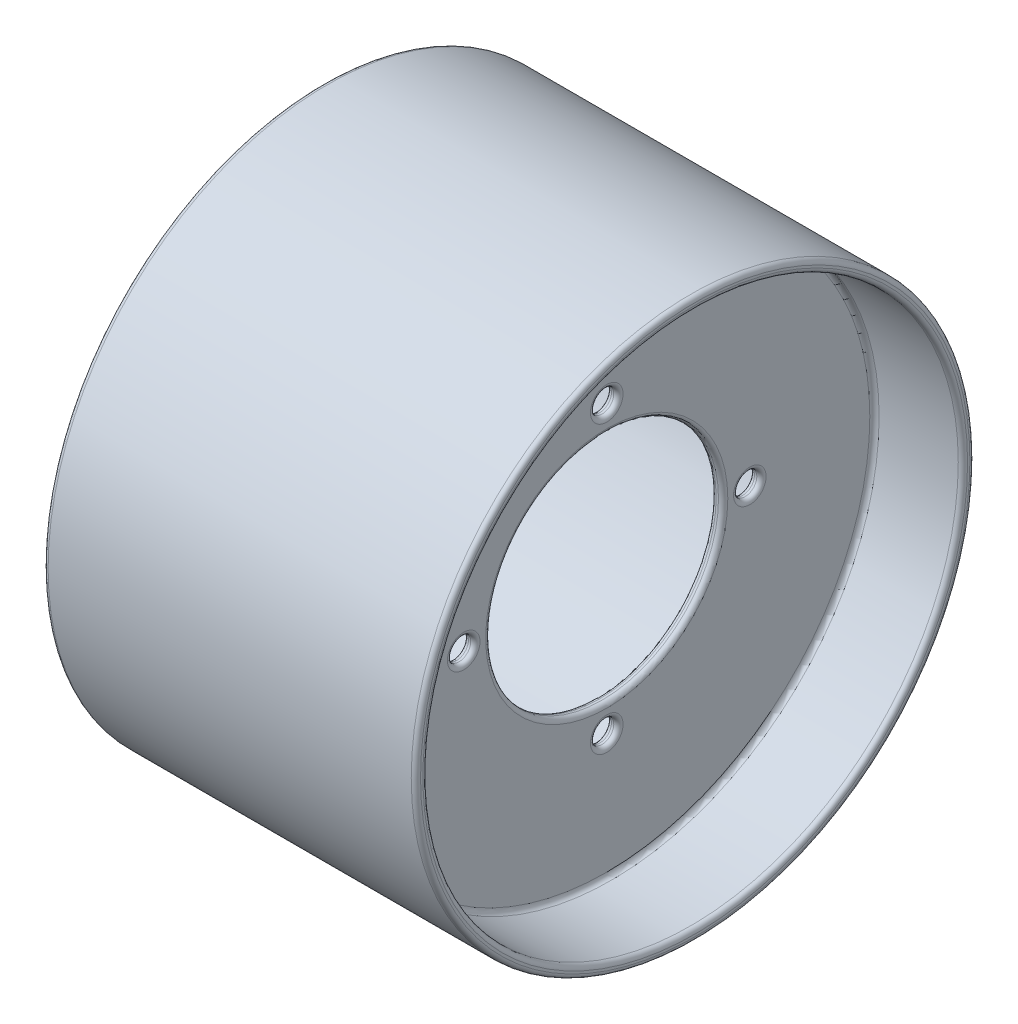
ISO-10303-21;
HEADER;
FILE_DESCRIPTION(('STEP AP214'),'2;1');
FILE_NAME('part.step','',(''),(''),'','','');
FILE_SCHEMA(('AUTOMOTIVE_DESIGN { 1 0 10303 214 1 1 1 1 }'));
ENDSEC;
DATA;
#1=APPLICATION_CONTEXT('core data for automotive mechanical design processes');
#2=APPLICATION_PROTOCOL_DEFINITION('international standard','automotive_design',2000,#1);
#3=PRODUCT_CONTEXT('',#1,'mechanical');
#4=PRODUCT('Part','Part','',(#3));
#5=PRODUCT_RELATED_PRODUCT_CATEGORY('part','',(#4));
#6=PRODUCT_DEFINITION_FORMATION('','',#4);
#7=PRODUCT_DEFINITION_CONTEXT('part definition',#1,'design');
#8=PRODUCT_DEFINITION('design','',#6,#7);
#9=PRODUCT_DEFINITION_SHAPE('','',#8);
#10=(LENGTH_UNIT() NAMED_UNIT(*) SI_UNIT(.MILLI.,.METRE.));
#11=(NAMED_UNIT(*) PLANE_ANGLE_UNIT() SI_UNIT($,.RADIAN.));
#12=(NAMED_UNIT(*) SI_UNIT($,.STERADIAN.) SOLID_ANGLE_UNIT());
#13=UNCERTAINTY_MEASURE_WITH_UNIT(LENGTH_MEASURE(1.E-05),#10,'distance_accuracy_value','');
#14=(GEOMETRIC_REPRESENTATION_CONTEXT(3) GLOBAL_UNCERTAINTY_ASSIGNED_CONTEXT((#13)) GLOBAL_UNIT_ASSIGNED_CONTEXT((#10,
#11,#12)) REPRESENTATION_CONTEXT('',''));
#15=CARTESIAN_POINT('',(0.,0.,0.));
#16=DIRECTION('',(0.,0.,1.));
#17=DIRECTION('',(1.,0.,0.));
#18=AXIS2_PLACEMENT_3D('',#15,#16,#17);
#19=CARTESIAN_POINT('',(203.2,0.,0.));
#20=DIRECTION('',(-1.,0.,0.));
#21=DIRECTION('',(0.,0.,1.));
#22=AXIS2_PLACEMENT_3D('',#19,#20,#21);
#23=CYLINDRICAL_SURFACE('',#22,146.05);
#24=CARTESIAN_POINT('',(146.05,0.,0.));
#25=DIRECTION('',(1.,0.,0.));
#26=DIRECTION('',(0.,0.,-1.));
#27=AXIS2_PLACEMENT_3D('',#24,#25,#26);
#28=CIRCLE('',#27,146.05);
#29=CARTESIAN_POINT('',(146.05,0.,-146.05));
#30=VERTEX_POINT('',#29);
#31=EDGE_CURVE('E108',#30,#30,#28,.T.);
#32=ORIENTED_EDGE('',*,*,#31,.T.);
#33=EDGE_LOOP('',(#32));
#34=FACE_BOUND('',#33,.T.);
#35=CARTESIAN_POINT('',(2.53999999999999,0.,0.));
#36=DIRECTION('',(1.,0.,0.));
#37=DIRECTION('',(0.,0.,-1.));
#38=AXIS2_PLACEMENT_3D('',#35,#36,#37);
#39=CIRCLE('',#38,146.05);
#40=CARTESIAN_POINT('',(2.53999999999999,0.,-146.05));
#41=VERTEX_POINT('',#40);
#42=EDGE_CURVE('E111',#41,#41,#39,.F.);
#43=ORIENTED_EDGE('',*,*,#42,.T.);
#44=EDGE_LOOP('',(#43));
#45=FACE_BOUND('',#44,.T.);
#46=ADVANCED_FACE('F31',(#34,#45),#23,.F.);
#47=CARTESIAN_POINT('',(203.2,0.,0.));
#48=DIRECTION('',(1.,0.,0.));
#49=DIRECTION('',(0.,0.,-1.));
#50=AXIS2_PLACEMENT_3D('',#47,#48,#49);
#51=PLANE('',#50);
#52=CARTESIAN_POINT('',(203.2,0.,0.));
#53=DIRECTION('',(1.,0.,0.));
#54=DIRECTION('',(0.,0.,-1.));
#55=AXIS2_PLACEMENT_3D('',#52,#53,#54);
#56=CIRCLE('',#55,149.86);
#57=CARTESIAN_POINT('',(203.2,0.,-149.86));
#58=VERTEX_POINT('',#57);
#59=EDGE_CURVE('E129',#58,#58,#56,.T.);
#60=ORIENTED_EDGE('',*,*,#59,.T.);
#61=EDGE_LOOP('',(#60));
#62=FACE_BOUND('',#61,.T.);
#63=CARTESIAN_POINT('',(203.2,0.,0.));
#64=DIRECTION('',(1.,0.,0.));
#65=DIRECTION('',(0.,0.,-1.));
#66=AXIS2_PLACEMENT_3D('',#63,#64,#65);
#67=CIRCLE('',#66,148.59);
#68=CARTESIAN_POINT('',(203.2,0.,-148.59));
#69=VERTEX_POINT('',#68);
#70=EDGE_CURVE('E132',#69,#69,#67,.F.);
#71=ORIENTED_EDGE('',*,*,#70,.T.);
#72=EDGE_LOOP('',(#71));
#73=FACE_BOUND('',#72,.T.);
#74=ADVANCED_FACE('F136',(#62,#73),#51,.T.);
#75=CARTESIAN_POINT('',(0.,0.,0.));
#76=DIRECTION('',(1.,0.,0.));
#77=DIRECTION('',(0.,0.,-1.));
#78=AXIS2_PLACEMENT_3D('',#75,#76,#77);
#79=PLANE('',#78);
#80=CARTESIAN_POINT('',(0.,0.,0.));
#81=DIRECTION('',(1.,0.,0.));
#82=DIRECTION('',(0.,0.,-1.));
#83=AXIS2_PLACEMENT_3D('',#80,#81,#82);
#84=CIRCLE('',#83,149.86);
#85=CARTESIAN_POINT('',(0.,0.,-149.86));
#86=VERTEX_POINT('',#85);
#87=EDGE_CURVE('E114',#86,#86,#84,.F.);
#88=ORIENTED_EDGE('',*,*,#87,.T.);
#89=EDGE_LOOP('',(#88));
#90=FACE_BOUND('',#89,.T.);
#91=CARTESIAN_POINT('',(0.,0.,0.));
#92=DIRECTION('',(1.,0.,0.));
#93=DIRECTION('',(0.,0.,-1.));
#94=AXIS2_PLACEMENT_3D('',#91,#92,#93);
#95=CIRCLE('',#94,148.59);
#96=CARTESIAN_POINT('',(0.,0.,-148.59));
#97=VERTEX_POINT('',#96);
#98=EDGE_CURVE('E117',#97,#97,#95,.T.);
#99=ORIENTED_EDGE('',*,*,#98,.T.);
#100=EDGE_LOOP('',(#99));
#101=FACE_BOUND('',#100,.T.);
#102=ADVANCED_FACE('F157',(#90,#101),#79,.F.);
#103=CARTESIAN_POINT('',(203.2,0.,0.));
#104=DIRECTION('',(-1.,0.,0.));
#105=DIRECTION('',(0.,0.,1.));
#106=AXIS2_PLACEMENT_3D('',#103,#104,#105);
#107=CYLINDRICAL_SURFACE('',#106,152.4);
#108=CARTESIAN_POINT('',(2.53999999999999,0.,0.));
#109=DIRECTION('',(1.,0.,0.));
#110=DIRECTION('',(0.,0.,-1.));
#111=AXIS2_PLACEMENT_3D('',#108,#109,#110);
#112=CIRCLE('',#111,152.4);
#113=CARTESIAN_POINT('',(2.53999999999999,0.,-152.4));
#114=VERTEX_POINT('',#113);
#115=EDGE_CURVE('E120',#114,#114,#112,.T.);
#116=ORIENTED_EDGE('',*,*,#115,.T.);
#117=EDGE_LOOP('',(#116));
#118=FACE_BOUND('',#117,.T.);
#119=CARTESIAN_POINT('',(200.66,0.,0.));
#120=DIRECTION('',(1.,0.,0.));
#121=DIRECTION('',(0.,0.,-1.));
#122=AXIS2_PLACEMENT_3D('',#119,#120,#121);
#123=CIRCLE('',#122,152.4);
#124=CARTESIAN_POINT('',(200.66,0.,-152.4));
#125=VERTEX_POINT('',#124);
#126=EDGE_CURVE('E126',#125,#125,#123,.F.);
#127=ORIENTED_EDGE('',*,*,#126,.T.);
#128=EDGE_LOOP('',(#127));
#129=FACE_BOUND('',#128,.T.);
#130=ADVANCED_FACE('F148',(#118,#129),#107,.T.);
#131=CARTESIAN_POINT('',(157.48,0.,0.));
#132=DIRECTION('',(1.,0.,0.));
#133=DIRECTION('',(0.,0.,-1.));
#134=AXIS2_PLACEMENT_3D('',#131,#132,#133);
#135=CIRCLE('',#134,146.05);
#136=CARTESIAN_POINT('',(157.48,0.,-146.05));
#137=VERTEX_POINT('',#136);
#138=EDGE_CURVE('E99',#137,#137,#135,.F.);
#139=ORIENTED_EDGE('',*,*,#138,.T.);
#140=EDGE_LOOP('',(#139));
#141=FACE_BOUND('',#140,.T.);
#142=CARTESIAN_POINT('',(200.66,0.,0.));
#143=DIRECTION('',(1.,0.,0.));
#144=DIRECTION('',(0.,0.,-1.));
#145=AXIS2_PLACEMENT_3D('',#142,#143,#144);
#146=CIRCLE('',#145,146.05);
#147=CARTESIAN_POINT('',(200.66,0.,-146.05));
#148=VERTEX_POINT('',#147);
#149=EDGE_CURVE('E123',#148,#148,#146,.T.);
#150=ORIENTED_EDGE('',*,*,#149,.T.);
#151=EDGE_LOOP('',(#150));
#152=FACE_BOUND('',#151,.T.);
#153=ADVANCED_FACE('F146',(#141,#152),#23,.F.);
#154=CARTESIAN_POINT('',(200.66,0.,0.));
#155=DIRECTION('',(1.,0.,0.));
#156=DIRECTION('',(0.,0.,-1.));
#157=AXIS2_PLACEMENT_3D('',#154,#155,#156);
#158=TOROIDAL_SURFACE('',#157,149.86,2.54);
#159=ORIENTED_EDGE('',*,*,#126,.F.);
#160=EDGE_LOOP('',(#159));
#161=FACE_BOUND('',#160,.T.);
#162=ORIENTED_EDGE('',*,*,#59,.F.);
#163=EDGE_LOOP('',(#162));
#164=FACE_BOUND('',#163,.T.);
#165=ADVANCED_FACE('F142',(#161,#164),#158,.T.);
#166=CARTESIAN_POINT('',(200.66,0.,0.));
#167=DIRECTION('',(1.,0.,0.));
#168=DIRECTION('',(0.,0.,-1.));
#169=AXIS2_PLACEMENT_3D('',#166,#167,#168);
#170=TOROIDAL_SURFACE('',#169,148.59,2.54);
#171=ORIENTED_EDGE('',*,*,#70,.F.);
#172=EDGE_LOOP('',(#171));
#173=FACE_BOUND('',#172,.T.);
#174=ORIENTED_EDGE('',*,*,#149,.F.);
#175=EDGE_LOOP('',(#174));
#176=FACE_BOUND('',#175,.T.);
#177=ADVANCED_FACE('F138',(#173,#176),#170,.T.);
#178=CARTESIAN_POINT('',(2.53999999999999,0.,0.));
#179=DIRECTION('',(1.,0.,0.));
#180=DIRECTION('',(0.,0.,-1.));
#181=AXIS2_PLACEMENT_3D('',#178,#179,#180);
#182=TOROIDAL_SURFACE('',#181,149.86,2.54);
#183=ORIENTED_EDGE('',*,*,#87,.F.);
#184=EDGE_LOOP('',(#183));
#185=FACE_BOUND('',#184,.T.);
#186=ORIENTED_EDGE('',*,*,#115,.F.);
#187=EDGE_LOOP('',(#186));
#188=FACE_BOUND('',#187,.T.);
#189=ADVANCED_FACE('F141',(#185,#188),#182,.T.);
#190=CARTESIAN_POINT('',(2.53999999999999,0.,0.));
#191=DIRECTION('',(1.,0.,0.));
#192=DIRECTION('',(0.,0.,-1.));
#193=AXIS2_PLACEMENT_3D('',#190,#191,#192);
#194=TOROIDAL_SURFACE('',#193,148.59,2.54);
#195=ORIENTED_EDGE('',*,*,#42,.F.);
#196=EDGE_LOOP('',(#195));
#197=FACE_BOUND('',#196,.T.);
#198=ORIENTED_EDGE('',*,*,#98,.F.);
#199=EDGE_LOOP('',(#198));
#200=FACE_BOUND('',#199,.T.);
#201=ADVANCED_FACE('F172',(#197,#200),#194,.T.);
#202=CARTESIAN_POINT('',(154.94,0.,0.));
#203=DIRECTION('',(1.,0.,0.));
#204=DIRECTION('',(0.,0.,-1.));
#205=AXIS2_PLACEMENT_3D('',#202,#203,#204);
#206=PLANE('',#205);
#207=CARTESIAN_POINT('',(154.94,0.,0.));
#208=DIRECTION('',(1.,0.,0.));
#209=DIRECTION('',(0.,0.,-1.));
#210=AXIS2_PLACEMENT_3D('',#207,#208,#209);
#211=CIRCLE('',#210,66.04);
#212=CARTESIAN_POINT('',(154.94,0.,-66.04));
#213=VERTEX_POINT('',#212);
#214=EDGE_CURVE('E81',#213,#213,#211,.F.);
#215=ORIENTED_EDGE('',*,*,#214,.T.);
#216=EDGE_LOOP('',(#215));
#217=FACE_BOUND('',#216,.T.);
#218=CARTESIAN_POINT('',(154.94,0.,78.0415));
#219=DIRECTION('',(1.,0.,0.));
#220=DIRECTION('',(0.,0.,-1.));
#221=AXIS2_PLACEMENT_3D('',#218,#219,#220);
#222=CIRCLE('',#221,8.89);
#223=CARTESIAN_POINT('',(154.94,0.,69.1515));
#224=VERTEX_POINT('',#223);
#225=EDGE_CURVE('E84',#224,#224,#222,.F.);
#226=ORIENTED_EDGE('',*,*,#225,.T.);
#227=EDGE_LOOP('',(#226));
#228=FACE_BOUND('',#227,.T.);
#229=CARTESIAN_POINT('',(154.94,-78.0415,0.));
#230=DIRECTION('',(1.,0.,0.));
#231=DIRECTION('',(0.,0.,-1.));
#232=AXIS2_PLACEMENT_3D('',#229,#230,#231);
#233=CIRCLE('',#232,8.89);
#234=CARTESIAN_POINT('',(154.94,-78.0415,-8.89));
#235=VERTEX_POINT('',#234);
#236=EDGE_CURVE('E87',#235,#235,#233,.F.);
#237=ORIENTED_EDGE('',*,*,#236,.T.);
#238=EDGE_LOOP('',(#237));
#239=FACE_BOUND('',#238,.T.);
#240=CARTESIAN_POINT('',(154.94,0.,-78.0415));
#241=DIRECTION('',(1.,0.,0.));
#242=DIRECTION('',(0.,0.,-1.));
#243=AXIS2_PLACEMENT_3D('',#240,#241,#242);
#244=CIRCLE('',#243,8.89000000000001);
#245=CARTESIAN_POINT('',(154.94,0.,-86.9315));
#246=VERTEX_POINT('',#245);
#247=EDGE_CURVE('E90',#246,#246,#244,.F.);
#248=ORIENTED_EDGE('',*,*,#247,.T.);
#249=EDGE_LOOP('',(#248));
#250=FACE_BOUND('',#249,.T.);
#251=CARTESIAN_POINT('',(154.94,78.0415,0.));
#252=DIRECTION('',(1.,0.,0.));
#253=DIRECTION('',(0.,0.,-1.));
#254=AXIS2_PLACEMENT_3D('',#251,#252,#253);
#255=CIRCLE('',#254,8.89);
#256=CARTESIAN_POINT('',(154.94,78.0415,-8.89));
#257=VERTEX_POINT('',#256);
#258=EDGE_CURVE('E93',#257,#257,#255,.F.);
#259=ORIENTED_EDGE('',*,*,#258,.T.);
#260=EDGE_LOOP('',(#259));
#261=FACE_BOUND('',#260,.T.);
#262=CARTESIAN_POINT('',(154.94,0.,0.));
#263=DIRECTION('',(1.,0.,0.));
#264=DIRECTION('',(0.,0.,-1.));
#265=AXIS2_PLACEMENT_3D('',#262,#263,#264);
#266=CIRCLE('',#265,143.51);
#267=CARTESIAN_POINT('',(154.94,0.,-143.51));
#268=VERTEX_POINT('',#267);
#269=EDGE_CURVE('E102',#268,#268,#266,.T.);
#270=ORIENTED_EDGE('',*,*,#269,.T.);
#271=EDGE_LOOP('',(#270));
#272=FACE_BOUND('',#271,.T.);
#273=ADVANCED_FACE('F175',(#217,#228,#239,#250,#261,#272),#206,.T.);
#274=CARTESIAN_POINT('',(148.59,0.,0.));
#275=DIRECTION('',(1.,0.,0.));
#276=DIRECTION('',(0.,0.,-1.));
#277=AXIS2_PLACEMENT_3D('',#274,#275,#276);
#278=PLANE('',#277);
#279=CARTESIAN_POINT('',(148.59,0.,-78.0415));
#280=DIRECTION('',(1.,0.,0.));
#281=DIRECTION('',(0.,0.,-1.));
#282=AXIS2_PLACEMENT_3D('',#279,#280,#281);
#283=CIRCLE('',#282,8.89000000000001);
#284=CARTESIAN_POINT('',(148.59,0.,-86.9315));
#285=VERTEX_POINT('',#284);
#286=EDGE_CURVE('E54',#285,#285,#283,.T.);
#287=ORIENTED_EDGE('',*,*,#286,.T.);
#288=EDGE_LOOP('',(#287));
#289=FACE_BOUND('',#288,.T.);
#290=CARTESIAN_POINT('',(148.59,-78.0415,0.));
#291=DIRECTION('',(1.,0.,0.));
#292=DIRECTION('',(0.,0.,-1.));
#293=AXIS2_PLACEMENT_3D('',#290,#291,#292);
#294=CIRCLE('',#293,8.89);
#295=CARTESIAN_POINT('',(148.59,-78.0415,-8.89));
#296=VERTEX_POINT('',#295);
#297=EDGE_CURVE('E57',#296,#296,#294,.T.);
#298=ORIENTED_EDGE('',*,*,#297,.T.);
#299=EDGE_LOOP('',(#298));
#300=FACE_BOUND('',#299,.T.);
#301=CARTESIAN_POINT('',(148.59,0.,78.0415));
#302=DIRECTION('',(1.,0.,0.));
#303=DIRECTION('',(0.,0.,-1.));
#304=AXIS2_PLACEMENT_3D('',#301,#302,#303);
#305=CIRCLE('',#304,8.89);
#306=CARTESIAN_POINT('',(148.59,0.,69.1515));
#307=VERTEX_POINT('',#306);
#308=EDGE_CURVE('E60',#307,#307,#305,.T.);
#309=ORIENTED_EDGE('',*,*,#308,.T.);
#310=EDGE_LOOP('',(#309));
#311=FACE_BOUND('',#310,.T.);
#312=CARTESIAN_POINT('',(148.59,0.,0.));
#313=DIRECTION('',(1.,0.,0.));
#314=DIRECTION('',(0.,0.,-1.));
#315=AXIS2_PLACEMENT_3D('',#312,#313,#314);
#316=CIRCLE('',#315,66.04);
#317=CARTESIAN_POINT('',(148.59,0.,-66.04));
#318=VERTEX_POINT('',#317);
#319=EDGE_CURVE('E63',#318,#318,#316,.T.);
#320=ORIENTED_EDGE('',*,*,#319,.T.);
#321=EDGE_LOOP('',(#320));
#322=FACE_BOUND('',#321,.T.);
#323=CARTESIAN_POINT('',(148.59,78.0415,0.));
#324=DIRECTION('',(1.,0.,0.));
#325=DIRECTION('',(0.,0.,-1.));
#326=AXIS2_PLACEMENT_3D('',#323,#324,#325);
#327=CIRCLE('',#326,8.89);
#328=CARTESIAN_POINT('',(148.59,78.0415,-8.89));
#329=VERTEX_POINT('',#328);
#330=EDGE_CURVE('E66',#329,#329,#327,.T.);
#331=ORIENTED_EDGE('',*,*,#330,.T.);
#332=EDGE_LOOP('',(#331));
#333=FACE_BOUND('',#332,.T.);
#334=CARTESIAN_POINT('',(148.59,0.,0.));
#335=DIRECTION('',(1.,0.,0.));
#336=DIRECTION('',(0.,0.,-1.));
#337=AXIS2_PLACEMENT_3D('',#334,#335,#336);
#338=CIRCLE('',#337,143.51);
#339=CARTESIAN_POINT('',(148.59,0.,-143.51));
#340=VERTEX_POINT('',#339);
#341=EDGE_CURVE('E105',#340,#340,#338,.F.);
#342=ORIENTED_EDGE('',*,*,#341,.T.);
#343=EDGE_LOOP('',(#342));
#344=FACE_BOUND('',#343,.T.);
#345=ADVANCED_FACE('F192',(#289,#300,#311,#322,#333,#344),#278,.F.);
#346=CARTESIAN_POINT('',(146.05,0.,0.));
#347=DIRECTION('',(1.,0.,0.));
#348=DIRECTION('',(0.,0.,-1.));
#349=AXIS2_PLACEMENT_3D('',#346,#347,#348);
#350=TOROIDAL_SURFACE('',#349,143.51,2.54);
#351=ORIENTED_EDGE('',*,*,#341,.F.);
#352=EDGE_LOOP('',(#351));
#353=FACE_BOUND('',#352,.T.);
#354=ORIENTED_EDGE('',*,*,#31,.F.);
#355=EDGE_LOOP('',(#354));
#356=FACE_BOUND('',#355,.T.);
#357=ADVANCED_FACE('F188',(#353,#356),#350,.F.);
#358=CARTESIAN_POINT('',(157.48,0.,0.));
#359=DIRECTION('',(1.,0.,0.));
#360=DIRECTION('',(0.,0.,-1.));
#361=AXIS2_PLACEMENT_3D('',#358,#359,#360);
#362=TOROIDAL_SURFACE('',#361,143.51,2.54);
#363=ORIENTED_EDGE('',*,*,#138,.F.);
#364=EDGE_LOOP('',(#363));
#365=FACE_BOUND('',#364,.T.);
#366=ORIENTED_EDGE('',*,*,#269,.F.);
#367=EDGE_LOOP('',(#366));
#368=FACE_BOUND('',#367,.T.);
#369=ADVANCED_FACE('F191',(#365,#368),#362,.F.);
#370=CARTESIAN_POINT('',(0.,78.0415,0.));
#371=DIRECTION('',(1.,0.,0.));
#372=DIRECTION('',(0.,0.,-1.));
#373=AXIS2_PLACEMENT_3D('',#370,#371,#372);
#374=CYLINDRICAL_SURFACE('',#373,6.35);
#375=CARTESIAN_POINT('',(151.13,78.0415,0.));
#376=DIRECTION('',(1.,0.,0.));
#377=DIRECTION('',(0.,0.,-1.));
#378=AXIS2_PLACEMENT_3D('',#375,#376,#377);
#379=CIRCLE('',#378,6.35);
#380=CARTESIAN_POINT('',(151.13,78.0415,-6.35));
#381=VERTEX_POINT('',#380);
#382=EDGE_CURVE('E10',#381,#381,#379,.F.);
#383=CARTESIAN_POINT('',(152.4,78.0415,0.));
#384=DIRECTION('',(1.,0.,0.));
#385=DIRECTION('',(0.,0.,-1.));
#386=AXIS2_PLACEMENT_3D('',#383,#384,#385);
#387=CIRCLE('',#386,6.35);
#388=CARTESIAN_POINT('',(152.4,78.0415,-6.35));
#389=VERTEX_POINT('',#388);
#390=EDGE_CURVE('E69',#389,#389,#387,.T.);
#391=CARTESIAN_POINT('',(151.13,78.0415,-6.35));
#392=CARTESIAN_POINT('',(151.143229166667,78.0415,-6.35));
#393=CARTESIAN_POINT('',(151.156458333333,78.0415,-6.35));
#394=CARTESIAN_POINT('',(151.182916666667,78.0415,-6.35));
#395=CARTESIAN_POINT('',(151.196145833333,78.0415,-6.35));
#396=CARTESIAN_POINT('',(151.222604166667,78.0415,-6.35));
#397=CARTESIAN_POINT('',(151.235833333333,78.0415,-6.35));
#398=CARTESIAN_POINT('',(151.262291666667,78.0415,-6.35));
#399=CARTESIAN_POINT('',(151.275520833333,78.0415,-6.35));
#400=CARTESIAN_POINT('',(151.301979166667,78.0415,-6.35));
#401=CARTESIAN_POINT('',(151.315208333333,78.0415,-6.35));
#402=CARTESIAN_POINT('',(151.341666666667,78.0415,-6.35));
#403=CARTESIAN_POINT('',(151.354895833333,78.0415,-6.35));
#404=CARTESIAN_POINT('',(151.381354166667,78.0415,-6.35));
#405=CARTESIAN_POINT('',(151.394583333333,78.0415,-6.35));
#406=CARTESIAN_POINT('',(151.421041666667,78.0415,-6.35));
#407=CARTESIAN_POINT('',(151.434270833333,78.0415,-6.35));
#408=CARTESIAN_POINT('',(151.460729166667,78.0415,-6.35));
#409=CARTESIAN_POINT('',(151.473958333333,78.0415,-6.35));
#410=CARTESIAN_POINT('',(151.500416666667,78.0415,-6.35));
#411=CARTESIAN_POINT('',(151.513645833333,78.0415,-6.35));
#412=CARTESIAN_POINT('',(151.540104166667,78.0415,-6.35));
#413=CARTESIAN_POINT('',(151.553333333333,78.0415,-6.35));
#414=CARTESIAN_POINT('',(151.579791666667,78.0415,-6.35));
#415=CARTESIAN_POINT('',(151.593020833333,78.0415,-6.35));
#416=CARTESIAN_POINT('',(151.619479166667,78.0415,-6.35));
#417=CARTESIAN_POINT('',(151.632708333333,78.0415,-6.35));
#418=CARTESIAN_POINT('',(151.659166666667,78.0415,-6.35));
#419=CARTESIAN_POINT('',(151.672395833333,78.0415,-6.35));
#420=CARTESIAN_POINT('',(151.698854166667,78.0415,-6.35));
#421=CARTESIAN_POINT('',(151.712083333333,78.0415,-6.35));
#422=CARTESIAN_POINT('',(151.738541666667,78.0415,-6.35));
#423=CARTESIAN_POINT('',(151.751770833333,78.0415,-6.35));
#424=CARTESIAN_POINT('',(151.778229166667,78.0415,-6.35));
#425=CARTESIAN_POINT('',(151.791458333333,78.0415,-6.35));
#426=CARTESIAN_POINT('',(151.817916666667,78.0415,-6.35));
#427=CARTESIAN_POINT('',(151.831145833333,78.0415,-6.35));
#428=CARTESIAN_POINT('',(151.857604166667,78.0415,-6.35));
#429=CARTESIAN_POINT('',(151.870833333333,78.0415,-6.35));
#430=CARTESIAN_POINT('',(151.897291666667,78.0415,-6.35));
#431=CARTESIAN_POINT('',(151.910520833333,78.0415,-6.35));
#432=CARTESIAN_POINT('',(151.936979166667,78.0415,-6.35));
#433=CARTESIAN_POINT('',(151.950208333333,78.0415,-6.35));
#434=CARTESIAN_POINT('',(151.976666666667,78.0415,-6.35));
#435=CARTESIAN_POINT('',(151.989895833333,78.0415,-6.35));
#436=CARTESIAN_POINT('',(152.016354166667,78.0415,-6.35));
#437=CARTESIAN_POINT('',(152.029583333333,78.0415,-6.35));
#438=CARTESIAN_POINT('',(152.056041666667,78.0415,-6.35));
#439=CARTESIAN_POINT('',(152.069270833333,78.0415,-6.35));
#440=CARTESIAN_POINT('',(152.095729166667,78.0415,-6.35));
#441=CARTESIAN_POINT('',(152.108958333333,78.0415,-6.35));
#442=CARTESIAN_POINT('',(152.135416666667,78.0415,-6.35));
#443=CARTESIAN_POINT('',(152.148645833333,78.0415,-6.35));
#444=CARTESIAN_POINT('',(152.175104166667,78.0415,-6.35));
#445=CARTESIAN_POINT('',(152.188333333333,78.0415,-6.35));
#446=CARTESIAN_POINT('',(152.214791666667,78.0415,-6.35));
#447=CARTESIAN_POINT('',(152.228020833333,78.0415,-6.35));
#448=CARTESIAN_POINT('',(152.254479166667,78.0415,-6.35));
#449=CARTESIAN_POINT('',(152.267708333333,78.0415,-6.35));
#450=CARTESIAN_POINT('',(152.294166666667,78.0415,-6.35));
#451=CARTESIAN_POINT('',(152.307395833333,78.0415,-6.35));
#452=CARTESIAN_POINT('',(152.333854166667,78.0415,-6.35));
#453=CARTESIAN_POINT('',(152.347083333333,78.0415,-6.35));
#454=CARTESIAN_POINT('',(152.373541666667,78.0415,-6.35));
#455=CARTESIAN_POINT('',(152.386770833333,78.0415,-6.35));
#456=CARTESIAN_POINT('',(152.4,78.0415,-6.35));
#457=B_SPLINE_CURVE_WITH_KNOTS('',3,(#391,#392,#393,#394,#395,#396,#397,#398,#399,#400,#401,
#402,#403,#404,#405,#406,#407,#408,#409,#410,#411,#412,#413,#414,#415,#416,#417,#418,#419,#420,
#421,#422,#423,#424,#425,#426,#427,#428,#429,#430,#431,#432,#433,#434,#435,#436,#437,#438,#439,
#440,#441,#442,#443,#444,#445,#446,#447,#448,#449,#450,#451,#452,#453,#454,#455,#456),
.UNSPECIFIED.,.F.,.F.,(4,2,2,2,2,2,2,2,2,2,2,2,2,2,2,2,2,2,2,2,2,2,2,2,2,2,2,2,2,2,2,2,4),(0.,
0.0396874999999963,0.0793749999999926,0.119062499999989,0.158749999999985,0.198437500000009,
0.238125000000006,0.277812500000002,0.317499999999998,0.357187499999995,0.396874999999991,
0.436562499999987,0.476250000000011,0.515937500000008,0.555625000000004,0.5953125,
0.634999999999997,0.674687499999993,0.714374999999989,0.754062499999986,0.793749999999982,
0.833437500000006,0.873125000000002,0.912812499999999,0.952499999999995,0.992187499999991,
1.03187499999999,1.07156249999998,1.11125000000001,1.1509375,1.190625,1.2303125,
1.26999999999999),.UNSPECIFIED.);
#458=EDGE_CURVE('BSEAM196',#381,#389,#457,.T.);
#459=ORIENTED_EDGE('',*,*,#382,.T.);
#460=ORIENTED_EDGE('',*,*,#390,.T.);
#461=ORIENTED_EDGE('',*,*,#458,.T.);
#462=ORIENTED_EDGE('',*,*,#458,.F.);
#463=EDGE_LOOP('',(#459,#461,#460,#462));
#464=FACE_BOUND('',#463,.T.);
#465=ADVANCED_FACE('F196',(#464),#374,.F.);
#466=CARTESIAN_POINT('',(0.,-78.0415,0.));
#467=DIRECTION('',(1.,0.,0.));
#468=DIRECTION('',(0.,0.,-1.));
#469=AXIS2_PLACEMENT_3D('',#466,#467,#468);
#470=CYLINDRICAL_SURFACE('',#469,6.35);
#471=CARTESIAN_POINT('',(151.13,-78.0415,0.));
#472=DIRECTION('',(1.,0.,0.));
#473=DIRECTION('',(0.,0.,-1.));
#474=AXIS2_PLACEMENT_3D('',#471,#472,#473);
#475=CIRCLE('',#474,6.35);
#476=CARTESIAN_POINT('',(151.13,-78.0415,-6.35));
#477=VERTEX_POINT('',#476);
#478=EDGE_CURVE('E46',#477,#477,#475,.F.);
#479=CARTESIAN_POINT('',(152.4,-78.0415,0.));
#480=DIRECTION('',(1.,0.,0.));
#481=DIRECTION('',(0.,0.,-1.));
#482=AXIS2_PLACEMENT_3D('',#479,#480,#481);
#483=CIRCLE('',#482,6.35);
#484=CARTESIAN_POINT('',(152.4,-78.0415,-6.35));
#485=VERTEX_POINT('',#484);
#486=EDGE_CURVE('E75',#485,#485,#483,.T.);
#487=CARTESIAN_POINT('',(151.13,-78.0415,-6.35));
#488=CARTESIAN_POINT('',(151.143229166667,-78.0415,-6.35));
#489=CARTESIAN_POINT('',(151.156458333333,-78.0415,-6.35));
#490=CARTESIAN_POINT('',(151.182916666667,-78.0415,-6.35));
#491=CARTESIAN_POINT('',(151.196145833333,-78.0415,-6.35));
#492=CARTESIAN_POINT('',(151.222604166667,-78.0415,-6.35));
#493=CARTESIAN_POINT('',(151.235833333333,-78.0415,-6.35));
#494=CARTESIAN_POINT('',(151.262291666667,-78.0415,-6.35));
#495=CARTESIAN_POINT('',(151.275520833333,-78.0415,-6.35));
#496=CARTESIAN_POINT('',(151.301979166667,-78.0415,-6.35));
#497=CARTESIAN_POINT('',(151.315208333333,-78.0415,-6.35));
#498=CARTESIAN_POINT('',(151.341666666667,-78.0415,-6.35));
#499=CARTESIAN_POINT('',(151.354895833333,-78.0415,-6.35));
#500=CARTESIAN_POINT('',(151.381354166667,-78.0415,-6.35));
#501=CARTESIAN_POINT('',(151.394583333333,-78.0415,-6.35));
#502=CARTESIAN_POINT('',(151.421041666667,-78.0415,-6.35));
#503=CARTESIAN_POINT('',(151.434270833333,-78.0415,-6.35));
#504=CARTESIAN_POINT('',(151.460729166667,-78.0415,-6.35));
#505=CARTESIAN_POINT('',(151.473958333333,-78.0415,-6.35));
#506=CARTESIAN_POINT('',(151.500416666667,-78.0415,-6.35));
#507=CARTESIAN_POINT('',(151.513645833333,-78.0415,-6.35));
#508=CARTESIAN_POINT('',(151.540104166667,-78.0415,-6.35));
#509=CARTESIAN_POINT('',(151.553333333333,-78.0415,-6.35));
#510=CARTESIAN_POINT('',(151.579791666667,-78.0415,-6.35));
#511=CARTESIAN_POINT('',(151.593020833333,-78.0415,-6.35));
#512=CARTESIAN_POINT('',(151.619479166667,-78.0415,-6.35));
#513=CARTESIAN_POINT('',(151.632708333333,-78.0415,-6.35));
#514=CARTESIAN_POINT('',(151.659166666667,-78.0415,-6.35));
#515=CARTESIAN_POINT('',(151.672395833333,-78.0415,-6.35));
#516=CARTESIAN_POINT('',(151.698854166667,-78.0415,-6.35));
#517=CARTESIAN_POINT('',(151.712083333333,-78.0415,-6.35));
#518=CARTESIAN_POINT('',(151.738541666667,-78.0415,-6.35));
#519=CARTESIAN_POINT('',(151.751770833333,-78.0415,-6.35));
#520=CARTESIAN_POINT('',(151.778229166667,-78.0415,-6.35));
#521=CARTESIAN_POINT('',(151.791458333333,-78.0415,-6.35));
#522=CARTESIAN_POINT('',(151.817916666667,-78.0415,-6.35));
#523=CARTESIAN_POINT('',(151.831145833333,-78.0415,-6.35));
#524=CARTESIAN_POINT('',(151.857604166667,-78.0415,-6.35));
#525=CARTESIAN_POINT('',(151.870833333333,-78.0415,-6.35));
#526=CARTESIAN_POINT('',(151.897291666667,-78.0415,-6.35));
#527=CARTESIAN_POINT('',(151.910520833333,-78.0415,-6.35));
#528=CARTESIAN_POINT('',(151.936979166667,-78.0415,-6.35));
#529=CARTESIAN_POINT('',(151.950208333333,-78.0415,-6.35));
#530=CARTESIAN_POINT('',(151.976666666667,-78.0415,-6.35));
#531=CARTESIAN_POINT('',(151.989895833333,-78.0415,-6.35));
#532=CARTESIAN_POINT('',(152.016354166667,-78.0415,-6.35));
#533=CARTESIAN_POINT('',(152.029583333333,-78.0415,-6.35));
#534=CARTESIAN_POINT('',(152.056041666667,-78.0415,-6.35));
#535=CARTESIAN_POINT('',(152.069270833333,-78.0415,-6.35));
#536=CARTESIAN_POINT('',(152.095729166667,-78.0415,-6.35));
#537=CARTESIAN_POINT('',(152.108958333333,-78.0415,-6.35));
#538=CARTESIAN_POINT('',(152.135416666667,-78.0415,-6.35));
#539=CARTESIAN_POINT('',(152.148645833333,-78.0415,-6.35));
#540=CARTESIAN_POINT('',(152.175104166667,-78.0415,-6.35));
#541=CARTESIAN_POINT('',(152.188333333333,-78.0415,-6.35));
#542=CARTESIAN_POINT('',(152.214791666667,-78.0415,-6.35));
#543=CARTESIAN_POINT('',(152.228020833333,-78.0415,-6.35));
#544=CARTESIAN_POINT('',(152.254479166667,-78.0415,-6.35));
#545=CARTESIAN_POINT('',(152.267708333333,-78.0415,-6.35));
#546=CARTESIAN_POINT('',(152.294166666667,-78.0415,-6.35));
#547=CARTESIAN_POINT('',(152.307395833333,-78.0415,-6.35));
#548=CARTESIAN_POINT('',(152.333854166667,-78.0415,-6.35));
#549=CARTESIAN_POINT('',(152.347083333333,-78.0415,-6.35));
#550=CARTESIAN_POINT('',(152.373541666667,-78.0415,-6.35));
#551=CARTESIAN_POINT('',(152.386770833333,-78.0415,-6.35));
#552=CARTESIAN_POINT('',(152.4,-78.0415,-6.35));
#553=B_SPLINE_CURVE_WITH_KNOTS('',3,(#487,#488,#489,#490,#491,#492,#493,#494,#495,#496,#497,
#498,#499,#500,#501,#502,#503,#504,#505,#506,#507,#508,#509,#510,#511,#512,#513,#514,#515,#516,
#517,#518,#519,#520,#521,#522,#523,#524,#525,#526,#527,#528,#529,#530,#531,#532,#533,#534,#535,
#536,#537,#538,#539,#540,#541,#542,#543,#544,#545,#546,#547,#548,#549,#550,#551,#552),
.UNSPECIFIED.,.F.,.F.,(4,2,2,2,2,2,2,2,2,2,2,2,2,2,2,2,2,2,2,2,2,2,2,2,2,2,2,2,2,2,2,2,4),(0.,
0.0396874999999963,0.0793749999999926,0.119062499999989,0.158749999999985,0.198437500000009,
0.238125000000006,0.277812500000002,0.317499999999998,0.357187499999995,0.396874999999991,
0.436562499999987,0.476250000000011,0.515937500000008,0.555625000000004,0.5953125,
0.634999999999997,0.674687499999993,0.714374999999989,0.754062499999986,0.793749999999982,
0.833437500000006,0.873125000000002,0.912812499999999,0.952499999999995,0.992187499999991,
1.03187499999999,1.07156249999998,1.11125000000001,1.1509375,1.190625,1.2303125,
1.26999999999999),.UNSPECIFIED.);
#554=EDGE_CURVE('BSEAM257',#477,#485,#553,.T.);
#555=ORIENTED_EDGE('',*,*,#478,.T.);
#556=ORIENTED_EDGE('',*,*,#486,.T.);
#557=ORIENTED_EDGE('',*,*,#554,.T.);
#558=ORIENTED_EDGE('',*,*,#554,.F.);
#559=EDGE_LOOP('',(#555,#557,#556,#558));
#560=FACE_BOUND('',#559,.T.);
#561=ADVANCED_FACE('F257',(#560),#470,.F.);
#562=CARTESIAN_POINT('',(0.,0.,-78.0415));
#563=DIRECTION('',(1.,0.,0.));
#564=DIRECTION('',(0.,0.,-1.));
#565=AXIS2_PLACEMENT_3D('',#562,#563,#564);
#566=CYLINDRICAL_SURFACE('',#565,6.35000000000001);
#567=CARTESIAN_POINT('',(151.13,0.,-78.0415));
#568=DIRECTION('',(1.,0.,0.));
#569=DIRECTION('',(0.,0.,-1.));
#570=AXIS2_PLACEMENT_3D('',#567,#568,#569);
#571=CIRCLE('',#570,6.35000000000001);
#572=CARTESIAN_POINT('',(151.13,0.,-84.3915));
#573=VERTEX_POINT('',#572);
#574=EDGE_CURVE('E51',#573,#573,#571,.F.);
#575=CARTESIAN_POINT('',(152.4,0.,-78.0415));
#576=DIRECTION('',(1.,0.,0.));
#577=DIRECTION('',(0.,0.,-1.));
#578=AXIS2_PLACEMENT_3D('',#575,#576,#577);
#579=CIRCLE('',#578,6.35000000000001);
#580=CARTESIAN_POINT('',(152.4,0.,-84.3915));
#581=VERTEX_POINT('',#580);
#582=EDGE_CURVE('E72',#581,#581,#579,.T.);
#583=CARTESIAN_POINT('',(151.13,0.,-84.3915));
#584=CARTESIAN_POINT('',(151.143229166667,0.,-84.3915));
#585=CARTESIAN_POINT('',(151.156458333333,0.,-84.3915));
#586=CARTESIAN_POINT('',(151.182916666667,0.,-84.3915));
#587=CARTESIAN_POINT('',(151.196145833333,0.,-84.3915));
#588=CARTESIAN_POINT('',(151.222604166667,0.,-84.3915));
#589=CARTESIAN_POINT('',(151.235833333333,0.,-84.3915));
#590=CARTESIAN_POINT('',(151.262291666667,0.,-84.3915));
#591=CARTESIAN_POINT('',(151.275520833333,0.,-84.3915));
#592=CARTESIAN_POINT('',(151.301979166667,0.,-84.3915));
#593=CARTESIAN_POINT('',(151.315208333333,0.,-84.3915));
#594=CARTESIAN_POINT('',(151.341666666667,0.,-84.3915));
#595=CARTESIAN_POINT('',(151.354895833333,0.,-84.3915));
#596=CARTESIAN_POINT('',(151.381354166667,0.,-84.3915));
#597=CARTESIAN_POINT('',(151.394583333333,0.,-84.3915));
#598=CARTESIAN_POINT('',(151.421041666667,0.,-84.3915));
#599=CARTESIAN_POINT('',(151.434270833333,0.,-84.3915));
#600=CARTESIAN_POINT('',(151.460729166667,0.,-84.3915));
#601=CARTESIAN_POINT('',(151.473958333333,0.,-84.3915));
#602=CARTESIAN_POINT('',(151.500416666667,0.,-84.3915));
#603=CARTESIAN_POINT('',(151.513645833333,0.,-84.3915));
#604=CARTESIAN_POINT('',(151.540104166667,0.,-84.3915));
#605=CARTESIAN_POINT('',(151.553333333333,0.,-84.3915));
#606=CARTESIAN_POINT('',(151.579791666667,0.,-84.3915));
#607=CARTESIAN_POINT('',(151.593020833333,0.,-84.3915));
#608=CARTESIAN_POINT('',(151.619479166667,0.,-84.3915));
#609=CARTESIAN_POINT('',(151.632708333333,0.,-84.3915));
#610=CARTESIAN_POINT('',(151.659166666667,0.,-84.3915));
#611=CARTESIAN_POINT('',(151.672395833333,0.,-84.3915));
#612=CARTESIAN_POINT('',(151.698854166667,0.,-84.3915));
#613=CARTESIAN_POINT('',(151.712083333333,0.,-84.3915));
#614=CARTESIAN_POINT('',(151.738541666667,0.,-84.3915));
#615=CARTESIAN_POINT('',(151.751770833333,0.,-84.3915));
#616=CARTESIAN_POINT('',(151.778229166667,0.,-84.3915));
#617=CARTESIAN_POINT('',(151.791458333333,0.,-84.3915));
#618=CARTESIAN_POINT('',(151.817916666667,0.,-84.3915));
#619=CARTESIAN_POINT('',(151.831145833333,0.,-84.3915));
#620=CARTESIAN_POINT('',(151.857604166667,0.,-84.3915));
#621=CARTESIAN_POINT('',(151.870833333333,0.,-84.3915));
#622=CARTESIAN_POINT('',(151.897291666667,0.,-84.3915));
#623=CARTESIAN_POINT('',(151.910520833333,0.,-84.3915));
#624=CARTESIAN_POINT('',(151.936979166667,0.,-84.3915));
#625=CARTESIAN_POINT('',(151.950208333333,0.,-84.3915));
#626=CARTESIAN_POINT('',(151.976666666667,0.,-84.3915));
#627=CARTESIAN_POINT('',(151.989895833333,0.,-84.3915));
#628=CARTESIAN_POINT('',(152.016354166667,0.,-84.3915));
#629=CARTESIAN_POINT('',(152.029583333333,0.,-84.3915));
#630=CARTESIAN_POINT('',(152.056041666667,0.,-84.3915));
#631=CARTESIAN_POINT('',(152.069270833333,0.,-84.3915));
#632=CARTESIAN_POINT('',(152.095729166667,0.,-84.3915));
#633=CARTESIAN_POINT('',(152.108958333333,0.,-84.3915));
#634=CARTESIAN_POINT('',(152.135416666667,0.,-84.3915));
#635=CARTESIAN_POINT('',(152.148645833333,0.,-84.3915));
#636=CARTESIAN_POINT('',(152.175104166667,0.,-84.3915));
#637=CARTESIAN_POINT('',(152.188333333333,0.,-84.3915));
#638=CARTESIAN_POINT('',(152.214791666667,0.,-84.3915));
#639=CARTESIAN_POINT('',(152.228020833333,0.,-84.3915));
#640=CARTESIAN_POINT('',(152.254479166667,0.,-84.3915));
#641=CARTESIAN_POINT('',(152.267708333333,0.,-84.3915));
#642=CARTESIAN_POINT('',(152.294166666667,0.,-84.3915));
#643=CARTESIAN_POINT('',(152.307395833333,0.,-84.3915));
#644=CARTESIAN_POINT('',(152.333854166667,0.,-84.3915));
#645=CARTESIAN_POINT('',(152.347083333333,0.,-84.3915));
#646=CARTESIAN_POINT('',(152.373541666667,0.,-84.3915));
#647=CARTESIAN_POINT('',(152.386770833333,0.,-84.3915));
#648=CARTESIAN_POINT('',(152.4,0.,-84.3915));
#649=B_SPLINE_CURVE_WITH_KNOTS('',3,(#583,#584,#585,#586,#587,#588,#589,#590,#591,#592,#593,
#594,#595,#596,#597,#598,#599,#600,#601,#602,#603,#604,#605,#606,#607,#608,#609,#610,#611,#612,
#613,#614,#615,#616,#617,#618,#619,#620,#621,#622,#623,#624,#625,#626,#627,#628,#629,#630,#631,
#632,#633,#634,#635,#636,#637,#638,#639,#640,#641,#642,#643,#644,#645,#646,#647,#648),
.UNSPECIFIED.,.F.,.F.,(4,2,2,2,2,2,2,2,2,2,2,2,2,2,2,2,2,2,2,2,2,2,2,2,2,2,2,2,2,2,2,2,4),(0.,
0.0396874999999963,0.0793749999999926,0.119062499999989,0.158749999999985,0.198437500000009,
0.238125000000006,0.277812500000002,0.317499999999998,0.357187499999995,0.396874999999991,
0.436562499999987,0.476250000000011,0.515937500000008,0.555625000000004,0.5953125,
0.634999999999997,0.674687499999993,0.714374999999989,0.754062499999986,0.793749999999982,
0.833437500000006,0.873125000000002,0.912812499999999,0.952499999999995,0.992187499999991,
1.03187499999999,1.07156249999998,1.11125000000001,1.1509375,1.190625,1.2303125,
1.26999999999999),.UNSPECIFIED.);
#650=EDGE_CURVE('BSEAM260',#573,#581,#649,.T.);
#651=ORIENTED_EDGE('',*,*,#574,.T.);
#652=ORIENTED_EDGE('',*,*,#582,.T.);
#653=ORIENTED_EDGE('',*,*,#650,.T.);
#654=ORIENTED_EDGE('',*,*,#650,.F.);
#655=EDGE_LOOP('',(#651,#653,#652,#654));
#656=FACE_BOUND('',#655,.T.);
#657=ADVANCED_FACE('F260',(#656),#566,.F.);
#658=CARTESIAN_POINT('',(0.,0.,78.0415));
#659=DIRECTION('',(1.,0.,0.));
#660=DIRECTION('',(0.,0.,-1.));
#661=AXIS2_PLACEMENT_3D('',#658,#659,#660);
#662=CYLINDRICAL_SURFACE('',#661,6.35);
#663=CARTESIAN_POINT('',(151.13,0.,78.0415));
#664=DIRECTION('',(1.,0.,0.));
#665=DIRECTION('',(0.,0.,-1.));
#666=AXIS2_PLACEMENT_3D('',#663,#664,#665);
#667=CIRCLE('',#666,6.35);
#668=CARTESIAN_POINT('',(151.13,0.,71.6915));
#669=VERTEX_POINT('',#668);
#670=EDGE_CURVE('E42',#669,#669,#667,.F.);
#671=CARTESIAN_POINT('',(152.4,0.,78.0415));
#672=DIRECTION('',(1.,0.,0.));
#673=DIRECTION('',(0.,0.,-1.));
#674=AXIS2_PLACEMENT_3D('',#671,#672,#673);
#675=CIRCLE('',#674,6.35);
#676=CARTESIAN_POINT('',(152.4,0.,71.6915));
#677=VERTEX_POINT('',#676);
#678=EDGE_CURVE('E78',#677,#677,#675,.T.);
#679=CARTESIAN_POINT('',(151.13,0.,71.6915));
#680=CARTESIAN_POINT('',(151.143229166667,0.,71.6915));
#681=CARTESIAN_POINT('',(151.156458333333,0.,71.6915));
#682=CARTESIAN_POINT('',(151.182916666667,0.,71.6915));
#683=CARTESIAN_POINT('',(151.196145833333,0.,71.6915));
#684=CARTESIAN_POINT('',(151.222604166667,0.,71.6915));
#685=CARTESIAN_POINT('',(151.235833333333,0.,71.6915));
#686=CARTESIAN_POINT('',(151.262291666667,0.,71.6915));
#687=CARTESIAN_POINT('',(151.275520833333,0.,71.6915));
#688=CARTESIAN_POINT('',(151.301979166667,0.,71.6915));
#689=CARTESIAN_POINT('',(151.315208333333,0.,71.6915));
#690=CARTESIAN_POINT('',(151.341666666667,0.,71.6915));
#691=CARTESIAN_POINT('',(151.354895833333,0.,71.6915));
#692=CARTESIAN_POINT('',(151.381354166667,0.,71.6915));
#693=CARTESIAN_POINT('',(151.394583333333,0.,71.6915));
#694=CARTESIAN_POINT('',(151.421041666667,0.,71.6915));
#695=CARTESIAN_POINT('',(151.434270833333,0.,71.6915));
#696=CARTESIAN_POINT('',(151.460729166667,0.,71.6915));
#697=CARTESIAN_POINT('',(151.473958333333,0.,71.6915));
#698=CARTESIAN_POINT('',(151.500416666667,0.,71.6915));
#699=CARTESIAN_POINT('',(151.513645833333,0.,71.6915));
#700=CARTESIAN_POINT('',(151.540104166667,0.,71.6915));
#701=CARTESIAN_POINT('',(151.553333333333,0.,71.6915));
#702=CARTESIAN_POINT('',(151.579791666667,0.,71.6915));
#703=CARTESIAN_POINT('',(151.593020833333,0.,71.6915));
#704=CARTESIAN_POINT('',(151.619479166667,0.,71.6915));
#705=CARTESIAN_POINT('',(151.632708333333,0.,71.6915));
#706=CARTESIAN_POINT('',(151.659166666667,0.,71.6915));
#707=CARTESIAN_POINT('',(151.672395833333,0.,71.6915));
#708=CARTESIAN_POINT('',(151.698854166667,0.,71.6915));
#709=CARTESIAN_POINT('',(151.712083333333,0.,71.6915));
#710=CARTESIAN_POINT('',(151.738541666667,0.,71.6915));
#711=CARTESIAN_POINT('',(151.751770833333,0.,71.6915));
#712=CARTESIAN_POINT('',(151.778229166667,0.,71.6915));
#713=CARTESIAN_POINT('',(151.791458333333,0.,71.6915));
#714=CARTESIAN_POINT('',(151.817916666667,0.,71.6915));
#715=CARTESIAN_POINT('',(151.831145833333,0.,71.6915));
#716=CARTESIAN_POINT('',(151.857604166667,0.,71.6915));
#717=CARTESIAN_POINT('',(151.870833333333,0.,71.6915));
#718=CARTESIAN_POINT('',(151.897291666667,0.,71.6915));
#719=CARTESIAN_POINT('',(151.910520833333,0.,71.6915));
#720=CARTESIAN_POINT('',(151.936979166667,0.,71.6915));
#721=CARTESIAN_POINT('',(151.950208333333,0.,71.6915));
#722=CARTESIAN_POINT('',(151.976666666667,0.,71.6915));
#723=CARTESIAN_POINT('',(151.989895833333,0.,71.6915));
#724=CARTESIAN_POINT('',(152.016354166667,0.,71.6915));
#725=CARTESIAN_POINT('',(152.029583333333,0.,71.6915));
#726=CARTESIAN_POINT('',(152.056041666667,0.,71.6915));
#727=CARTESIAN_POINT('',(152.069270833333,0.,71.6915));
#728=CARTESIAN_POINT('',(152.095729166667,0.,71.6915));
#729=CARTESIAN_POINT('',(152.108958333333,0.,71.6915));
#730=CARTESIAN_POINT('',(152.135416666667,0.,71.6915));
#731=CARTESIAN_POINT('',(152.148645833333,0.,71.6915));
#732=CARTESIAN_POINT('',(152.175104166667,0.,71.6915));
#733=CARTESIAN_POINT('',(152.188333333333,0.,71.6915));
#734=CARTESIAN_POINT('',(152.214791666667,0.,71.6915));
#735=CARTESIAN_POINT('',(152.228020833333,0.,71.6915));
#736=CARTESIAN_POINT('',(152.254479166667,0.,71.6915));
#737=CARTESIAN_POINT('',(152.267708333333,0.,71.6915));
#738=CARTESIAN_POINT('',(152.294166666667,0.,71.6915));
#739=CARTESIAN_POINT('',(152.307395833333,0.,71.6915));
#740=CARTESIAN_POINT('',(152.333854166667,0.,71.6915));
#741=CARTESIAN_POINT('',(152.347083333333,0.,71.6915));
#742=CARTESIAN_POINT('',(152.373541666667,0.,71.6915));
#743=CARTESIAN_POINT('',(152.386770833333,0.,71.6915));
#744=CARTESIAN_POINT('',(152.4,0.,71.6915));
#745=B_SPLINE_CURVE_WITH_KNOTS('',3,(#679,#680,#681,#682,#683,#684,#685,#686,#687,#688,#689,
#690,#691,#692,#693,#694,#695,#696,#697,#698,#699,#700,#701,#702,#703,#704,#705,#706,#707,#708,
#709,#710,#711,#712,#713,#714,#715,#716,#717,#718,#719,#720,#721,#722,#723,#724,#725,#726,#727,
#728,#729,#730,#731,#732,#733,#734,#735,#736,#737,#738,#739,#740,#741,#742,#743,#744),
.UNSPECIFIED.,.F.,.F.,(4,2,2,2,2,2,2,2,2,2,2,2,2,2,2,2,2,2,2,2,2,2,2,2,2,2,2,2,2,2,2,2,4),(0.,
0.0396874999999963,0.0793749999999926,0.119062499999989,0.158749999999985,0.198437500000009,
0.238125000000006,0.277812500000002,0.317499999999998,0.357187499999995,0.396874999999991,
0.436562499999987,0.476250000000011,0.515937500000008,0.555625000000004,0.5953125,
0.634999999999997,0.674687499999993,0.714374999999989,0.754062499999986,0.793749999999982,
0.833437500000006,0.873125000000002,0.912812499999999,0.952499999999995,0.992187499999991,
1.03187499999999,1.07156249999998,1.11125000000001,1.1509375,1.190625,1.2303125,
1.26999999999999),.UNSPECIFIED.);
#746=EDGE_CURVE('BSEAM264',#669,#677,#745,.T.);
#747=ORIENTED_EDGE('',*,*,#670,.T.);
#748=ORIENTED_EDGE('',*,*,#678,.T.);
#749=ORIENTED_EDGE('',*,*,#746,.T.);
#750=ORIENTED_EDGE('',*,*,#746,.F.);
#751=EDGE_LOOP('',(#747,#749,#748,#750));
#752=FACE_BOUND('',#751,.T.);
#753=ADVANCED_FACE('F264',(#752),#662,.F.);
#754=CARTESIAN_POINT('',(0.,0.,0.));
#755=DIRECTION('',(1.,0.,0.));
#756=DIRECTION('',(0.,0.,-1.));
#757=AXIS2_PLACEMENT_3D('',#754,#755,#756);
#758=CYLINDRICAL_SURFACE('',#757,63.5);
#759=CARTESIAN_POINT('',(151.13,0.,0.));
#760=DIRECTION('',(1.,0.,0.));
#761=DIRECTION('',(0.,0.,-1.));
#762=AXIS2_PLACEMENT_3D('',#759,#760,#761);
#763=CIRCLE('',#762,63.5);
#764=CARTESIAN_POINT('',(151.13,0.,-63.5));
#765=VERTEX_POINT('',#764);
#766=EDGE_CURVE('E38',#765,#765,#763,.F.);
#767=CARTESIAN_POINT('',(152.4,0.,0.));
#768=DIRECTION('',(1.,0.,0.));
#769=DIRECTION('',(0.,0.,-1.));
#770=AXIS2_PLACEMENT_3D('',#767,#768,#769);
#771=CIRCLE('',#770,63.5);
#772=CARTESIAN_POINT('',(152.4,0.,-63.5));
#773=VERTEX_POINT('',#772);
#774=EDGE_CURVE('E96',#773,#773,#771,.T.);
#775=CARTESIAN_POINT('',(151.13,0.,-63.5));
#776=CARTESIAN_POINT('',(151.143229166667,0.,-63.5));
#777=CARTESIAN_POINT('',(151.156458333333,0.,-63.5));
#778=CARTESIAN_POINT('',(151.182916666667,0.,-63.5));
#779=CARTESIAN_POINT('',(151.196145833333,0.,-63.5));
#780=CARTESIAN_POINT('',(151.222604166667,0.,-63.5));
#781=CARTESIAN_POINT('',(151.235833333333,0.,-63.5));
#782=CARTESIAN_POINT('',(151.262291666667,0.,-63.5));
#783=CARTESIAN_POINT('',(151.275520833333,0.,-63.5));
#784=CARTESIAN_POINT('',(151.301979166667,0.,-63.5));
#785=CARTESIAN_POINT('',(151.315208333333,0.,-63.5));
#786=CARTESIAN_POINT('',(151.341666666667,0.,-63.5));
#787=CARTESIAN_POINT('',(151.354895833333,0.,-63.5));
#788=CARTESIAN_POINT('',(151.381354166667,0.,-63.5));
#789=CARTESIAN_POINT('',(151.394583333333,0.,-63.5));
#790=CARTESIAN_POINT('',(151.421041666667,0.,-63.5));
#791=CARTESIAN_POINT('',(151.434270833333,0.,-63.5));
#792=CARTESIAN_POINT('',(151.460729166667,0.,-63.5));
#793=CARTESIAN_POINT('',(151.473958333333,0.,-63.5));
#794=CARTESIAN_POINT('',(151.500416666667,0.,-63.5));
#795=CARTESIAN_POINT('',(151.513645833333,0.,-63.5));
#796=CARTESIAN_POINT('',(151.540104166667,0.,-63.5));
#797=CARTESIAN_POINT('',(151.553333333333,0.,-63.5));
#798=CARTESIAN_POINT('',(151.579791666667,0.,-63.5));
#799=CARTESIAN_POINT('',(151.593020833333,0.,-63.5));
#800=CARTESIAN_POINT('',(151.619479166667,0.,-63.5));
#801=CARTESIAN_POINT('',(151.632708333333,0.,-63.5));
#802=CARTESIAN_POINT('',(151.659166666667,0.,-63.5));
#803=CARTESIAN_POINT('',(151.672395833333,0.,-63.5));
#804=CARTESIAN_POINT('',(151.698854166667,0.,-63.5));
#805=CARTESIAN_POINT('',(151.712083333333,0.,-63.5));
#806=CARTESIAN_POINT('',(151.738541666667,0.,-63.5));
#807=CARTESIAN_POINT('',(151.751770833333,0.,-63.5));
#808=CARTESIAN_POINT('',(151.778229166667,0.,-63.5));
#809=CARTESIAN_POINT('',(151.791458333333,0.,-63.5));
#810=CARTESIAN_POINT('',(151.817916666667,0.,-63.5));
#811=CARTESIAN_POINT('',(151.831145833333,0.,-63.5));
#812=CARTESIAN_POINT('',(151.857604166667,0.,-63.5));
#813=CARTESIAN_POINT('',(151.870833333333,0.,-63.5));
#814=CARTESIAN_POINT('',(151.897291666667,0.,-63.5));
#815=CARTESIAN_POINT('',(151.910520833333,0.,-63.5));
#816=CARTESIAN_POINT('',(151.936979166667,0.,-63.5));
#817=CARTESIAN_POINT('',(151.950208333333,0.,-63.5));
#818=CARTESIAN_POINT('',(151.976666666667,0.,-63.5));
#819=CARTESIAN_POINT('',(151.989895833333,0.,-63.5));
#820=CARTESIAN_POINT('',(152.016354166667,0.,-63.5));
#821=CARTESIAN_POINT('',(152.029583333333,0.,-63.5));
#822=CARTESIAN_POINT('',(152.056041666667,0.,-63.5));
#823=CARTESIAN_POINT('',(152.069270833333,0.,-63.5));
#824=CARTESIAN_POINT('',(152.095729166667,0.,-63.5));
#825=CARTESIAN_POINT('',(152.108958333333,0.,-63.5));
#826=CARTESIAN_POINT('',(152.135416666667,0.,-63.5));
#827=CARTESIAN_POINT('',(152.148645833333,0.,-63.5));
#828=CARTESIAN_POINT('',(152.175104166667,0.,-63.5));
#829=CARTESIAN_POINT('',(152.188333333333,0.,-63.5));
#830=CARTESIAN_POINT('',(152.214791666667,0.,-63.5));
#831=CARTESIAN_POINT('',(152.228020833333,0.,-63.5));
#832=CARTESIAN_POINT('',(152.254479166667,0.,-63.5));
#833=CARTESIAN_POINT('',(152.267708333333,0.,-63.5));
#834=CARTESIAN_POINT('',(152.294166666667,0.,-63.5));
#835=CARTESIAN_POINT('',(152.307395833333,0.,-63.5));
#836=CARTESIAN_POINT('',(152.333854166667,0.,-63.5));
#837=CARTESIAN_POINT('',(152.347083333333,0.,-63.5));
#838=CARTESIAN_POINT('',(152.373541666667,0.,-63.5));
#839=CARTESIAN_POINT('',(152.386770833333,0.,-63.5));
#840=CARTESIAN_POINT('',(152.4,0.,-63.5));
#841=B_SPLINE_CURVE_WITH_KNOTS('',3,(#775,#776,#777,#778,#779,#780,#781,#782,#783,#784,#785,
#786,#787,#788,#789,#790,#791,#792,#793,#794,#795,#796,#797,#798,#799,#800,#801,#802,#803,#804,
#805,#806,#807,#808,#809,#810,#811,#812,#813,#814,#815,#816,#817,#818,#819,#820,#821,#822,#823,
#824,#825,#826,#827,#828,#829,#830,#831,#832,#833,#834,#835,#836,#837,#838,#839,#840),
.UNSPECIFIED.,.F.,.F.,(4,2,2,2,2,2,2,2,2,2,2,2,2,2,2,2,2,2,2,2,2,2,2,2,2,2,2,2,2,2,2,2,4),(0.,
0.0396874999999963,0.0793749999999926,0.119062500000017,0.158750000000013,0.198437500000009,
0.238125000000006,0.277812500000002,0.317500000000026,0.357187500000022,0.396875000000019,
0.436562500000015,0.476250000000011,0.515937500000008,0.555625000000032,0.595312500000028,
0.635000000000024,0.674687500000021,0.714375000000017,0.754062500000041,0.793750000000037,
0.833437500000034,0.87312500000003,0.912812500000026,0.952500000000023,0.992187500000047,
1.03187500000004,1.07156250000004,1.11125000000004,1.15093750000003,1.19062500000006,
1.23031250000005,1.27000000000005),.UNSPECIFIED.);
#842=EDGE_CURVE('BSEAM202',#765,#773,#841,.T.);
#843=ORIENTED_EDGE('',*,*,#766,.T.);
#844=ORIENTED_EDGE('',*,*,#774,.T.);
#845=ORIENTED_EDGE('',*,*,#842,.T.);
#846=ORIENTED_EDGE('',*,*,#842,.F.);
#847=EDGE_LOOP('',(#843,#845,#844,#846));
#848=FACE_BOUND('',#847,.T.);
#849=ADVANCED_FACE('F202',(#848),#758,.F.);
#850=CARTESIAN_POINT('',(152.4,0.,0.));
#851=DIRECTION('',(1.,0.,0.));
#852=DIRECTION('',(0.,0.,-1.));
#853=AXIS2_PLACEMENT_3D('',#850,#851,#852);
#854=TOROIDAL_SURFACE('',#853,66.04,2.54);
#855=ORIENTED_EDGE('',*,*,#214,.F.);
#856=EDGE_LOOP('',(#855));
#857=FACE_BOUND('',#856,.T.);
#858=ORIENTED_EDGE('',*,*,#774,.F.);
#859=EDGE_LOOP('',(#858));
#860=FACE_BOUND('',#859,.T.);
#861=ADVANCED_FACE('F198',(#857,#860),#854,.T.);
#862=CARTESIAN_POINT('',(152.4,0.,78.0415));
#863=DIRECTION('',(1.,0.,0.));
#864=DIRECTION('',(0.,0.,-1.));
#865=AXIS2_PLACEMENT_3D('',#862,#863,#864);
#866=TOROIDAL_SURFACE('',#865,8.89,2.54);
#867=ORIENTED_EDGE('',*,*,#225,.F.);
#868=EDGE_LOOP('',(#867));
#869=FACE_BOUND('',#868,.T.);
#870=ORIENTED_EDGE('',*,*,#678,.F.);
#871=EDGE_LOOP('',(#870));
#872=FACE_BOUND('',#871,.T.);
#873=ADVANCED_FACE('F201',(#869,#872),#866,.T.);
#874=CARTESIAN_POINT('',(152.4,-78.0415,0.));
#875=DIRECTION('',(1.,0.,0.));
#876=DIRECTION('',(0.,0.,-1.));
#877=AXIS2_PLACEMENT_3D('',#874,#875,#876);
#878=TOROIDAL_SURFACE('',#877,8.89,2.54);
#879=ORIENTED_EDGE('',*,*,#236,.F.);
#880=EDGE_LOOP('',(#879));
#881=FACE_BOUND('',#880,.T.);
#882=ORIENTED_EDGE('',*,*,#486,.F.);
#883=EDGE_LOOP('',(#882));
#884=FACE_BOUND('',#883,.T.);
#885=ADVANCED_FACE('F206',(#881,#884),#878,.T.);
#886=CARTESIAN_POINT('',(152.4,0.,-78.0415));
#887=DIRECTION('',(1.,0.,0.));
#888=DIRECTION('',(0.,0.,-1.));
#889=AXIS2_PLACEMENT_3D('',#886,#887,#888);
#890=TOROIDAL_SURFACE('',#889,8.89000000000001,2.54);
#891=ORIENTED_EDGE('',*,*,#247,.F.);
#892=EDGE_LOOP('',(#891));
#893=FACE_BOUND('',#892,.T.);
#894=ORIENTED_EDGE('',*,*,#582,.F.);
#895=EDGE_LOOP('',(#894));
#896=FACE_BOUND('',#895,.T.);
#897=ADVANCED_FACE('F210',(#893,#896),#890,.T.);
#898=CARTESIAN_POINT('',(152.4,78.0415,0.));
#899=DIRECTION('',(1.,0.,0.));
#900=DIRECTION('',(0.,0.,-1.));
#901=AXIS2_PLACEMENT_3D('',#898,#899,#900);
#902=TOROIDAL_SURFACE('',#901,8.89,2.54);
#903=ORIENTED_EDGE('',*,*,#258,.F.);
#904=EDGE_LOOP('',(#903));
#905=FACE_BOUND('',#904,.T.);
#906=ORIENTED_EDGE('',*,*,#390,.F.);
#907=EDGE_LOOP('',(#906));
#908=FACE_BOUND('',#907,.T.);
#909=ADVANCED_FACE('F214',(#905,#908),#902,.T.);
#910=CARTESIAN_POINT('',(151.13,0.,-78.0415));
#911=DIRECTION('',(1.,0.,0.));
#912=DIRECTION('',(0.,0.,-1.));
#913=AXIS2_PLACEMENT_3D('',#910,#911,#912);
#914=TOROIDAL_SURFACE('',#913,8.89000000000001,2.54);
#915=ORIENTED_EDGE('',*,*,#574,.F.);
#916=EDGE_LOOP('',(#915));
#917=FACE_BOUND('',#916,.T.);
#918=ORIENTED_EDGE('',*,*,#286,.F.);
#919=EDGE_LOOP('',(#918));
#920=FACE_BOUND('',#919,.T.);
#921=ADVANCED_FACE('F218',(#917,#920),#914,.T.);
#922=CARTESIAN_POINT('',(151.13,-78.0415,0.));
#923=DIRECTION('',(1.,0.,0.));
#924=DIRECTION('',(0.,0.,-1.));
#925=AXIS2_PLACEMENT_3D('',#922,#923,#924);
#926=TOROIDAL_SURFACE('',#925,8.89,2.54);
#927=ORIENTED_EDGE('',*,*,#478,.F.);
#928=EDGE_LOOP('',(#927));
#929=FACE_BOUND('',#928,.T.);
#930=ORIENTED_EDGE('',*,*,#297,.F.);
#931=EDGE_LOOP('',(#930));
#932=FACE_BOUND('',#931,.T.);
#933=ADVANCED_FACE('F222',(#929,#932),#926,.T.);
#934=CARTESIAN_POINT('',(151.13,0.,78.0415));
#935=DIRECTION('',(1.,0.,0.));
#936=DIRECTION('',(0.,0.,-1.));
#937=AXIS2_PLACEMENT_3D('',#934,#935,#936);
#938=TOROIDAL_SURFACE('',#937,8.89,2.54);
#939=ORIENTED_EDGE('',*,*,#670,.F.);
#940=EDGE_LOOP('',(#939));
#941=FACE_BOUND('',#940,.T.);
#942=ORIENTED_EDGE('',*,*,#308,.F.);
#943=EDGE_LOOP('',(#942));
#944=FACE_BOUND('',#943,.T.);
#945=ADVANCED_FACE('F226',(#941,#944),#938,.T.);
#946=CARTESIAN_POINT('',(151.13,0.,0.));
#947=DIRECTION('',(1.,0.,0.));
#948=DIRECTION('',(0.,0.,-1.));
#949=AXIS2_PLACEMENT_3D('',#946,#947,#948);
#950=TOROIDAL_SURFACE('',#949,66.04,2.54);
#951=ORIENTED_EDGE('',*,*,#766,.F.);
#952=EDGE_LOOP('',(#951));
#953=FACE_BOUND('',#952,.T.);
#954=ORIENTED_EDGE('',*,*,#319,.F.);
#955=EDGE_LOOP('',(#954));
#956=FACE_BOUND('',#955,.T.);
#957=ADVANCED_FACE('F229',(#953,#956),#950,.T.);
#958=CARTESIAN_POINT('',(151.13,78.0415,0.));
#959=DIRECTION('',(1.,0.,0.));
#960=DIRECTION('',(0.,0.,-1.));
#961=AXIS2_PLACEMENT_3D('',#958,#959,#960);
#962=TOROIDAL_SURFACE('',#961,8.89,2.54);
#963=ORIENTED_EDGE('',*,*,#382,.F.);
#964=EDGE_LOOP('',(#963));
#965=FACE_BOUND('',#964,.T.);
#966=ORIENTED_EDGE('',*,*,#330,.F.);
#967=EDGE_LOOP('',(#966));
#968=FACE_BOUND('',#967,.T.);
#969=ADVANCED_FACE('F33',(#965,#968),#962,.T.);
#970=CLOSED_SHELL('',(#46,#74,#102,#130,#153,#165,#177,#189,#201,#273,#345,#357,#369,#465,#561,
#657,#753,#849,#861,#873,#885,#897,#909,#921,#933,#945,#957,#969));
#971=MANIFOLD_SOLID_BREP('B2',#970);
#972=ADVANCED_BREP_SHAPE_REPRESENTATION('',(#18,#971),#14);
#973=SHAPE_DEFINITION_REPRESENTATION(#9,#972);
ENDSEC;
END-ISO-10303-21;
